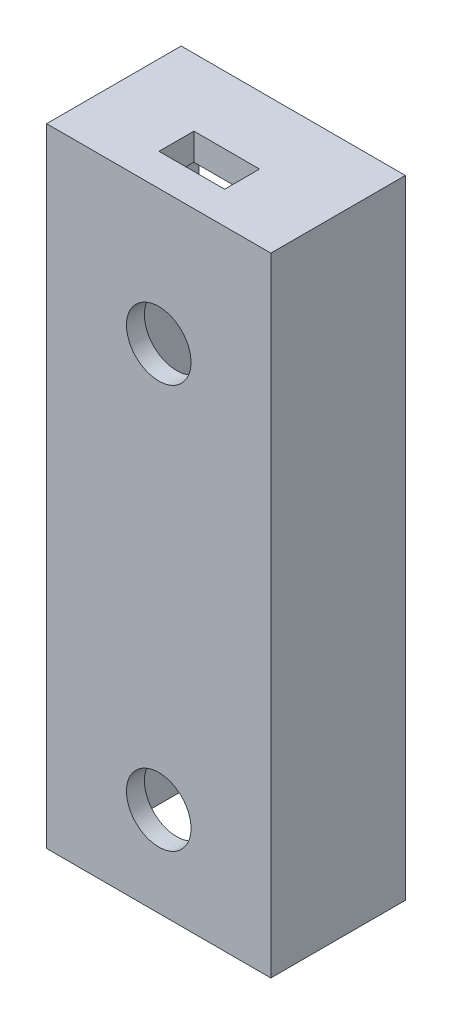
ISO-10303-21;
HEADER;
FILE_DESCRIPTION(('STEP AP214'),'2;1');
FILE_NAME('part.step','',(''),(''),'','','');
FILE_SCHEMA(('AUTOMOTIVE_DESIGN { 1 0 10303 214 1 1 1 1 }'));
ENDSEC;
DATA;
#1=APPLICATION_CONTEXT('core data for automotive mechanical design processes');
#2=APPLICATION_PROTOCOL_DEFINITION('international standard','automotive_design',2000,#1);
#3=PRODUCT_CONTEXT('',#1,'mechanical');
#4=PRODUCT('Part','Part','',(#3));
#5=PRODUCT_RELATED_PRODUCT_CATEGORY('part','',(#4));
#6=PRODUCT_DEFINITION_FORMATION('','',#4);
#7=PRODUCT_DEFINITION_CONTEXT('part definition',#1,'design');
#8=PRODUCT_DEFINITION('design','',#6,#7);
#9=PRODUCT_DEFINITION_SHAPE('','',#8);
#10=(LENGTH_UNIT() NAMED_UNIT(*) SI_UNIT(.MILLI.,.METRE.));
#11=(NAMED_UNIT(*) PLANE_ANGLE_UNIT() SI_UNIT($,.RADIAN.));
#12=(NAMED_UNIT(*) SI_UNIT($,.STERADIAN.) SOLID_ANGLE_UNIT());
#13=UNCERTAINTY_MEASURE_WITH_UNIT(LENGTH_MEASURE(1.E-05),#10,'distance_accuracy_value','');
#14=(GEOMETRIC_REPRESENTATION_CONTEXT(3) GLOBAL_UNCERTAINTY_ASSIGNED_CONTEXT((#13)) GLOBAL_UNIT_ASSIGNED_CONTEXT((#10,
#11,#12)) REPRESENTATION_CONTEXT('',''));
#15=CARTESIAN_POINT('',(0.,0.,0.));
#16=DIRECTION('',(0.,0.,1.));
#17=DIRECTION('',(1.,0.,0.));
#18=AXIS2_PLACEMENT_3D('',#15,#16,#17);
#19=CARTESIAN_POINT('',(-10.5,-35.001,-15.));
#20=DIRECTION('',(-1.,0.,0.));
#21=DIRECTION('',(0.,0.,1.));
#22=AXIS2_PLACEMENT_3D('',#19,#20,#21);
#23=PLANE('',#22);
#24=DIRECTION('',(0.,0.,-1.));
#25=VECTOR('',#24,1.);
#26=CARTESIAN_POINT('',(-10.5,32.,-15.));
#27=LINE('',#26,#25);
#28=CARTESIAN_POINT('',(-10.5,32.,-2.));
#29=VERTEX_POINT('',#28);
#30=CARTESIAN_POINT('',(-10.5,32.,-15.));
#31=VERTEX_POINT('',#30);
#32=EDGE_CURVE('E201',#29,#31,#27,.T.);
#33=ORIENTED_EDGE('',*,*,#32,.F.);
#34=DIRECTION('',(0.,1.,0.));
#35=VECTOR('',#34,1.);
#36=CARTESIAN_POINT('',(-10.5,-35.001,-2.));
#37=LINE('',#36,#35);
#38=CARTESIAN_POINT('',(-10.5,-35.,-2.));
#39=VERTEX_POINT('',#38);
#40=EDGE_CURVE('E212',#39,#29,#37,.T.);
#41=ORIENTED_EDGE('',*,*,#40,.F.);
#42=DIRECTION('',(0.,0.,1.));
#43=VECTOR('',#42,1.);
#44=CARTESIAN_POINT('',(-10.5,-35.,-15.));
#45=LINE('',#44,#43);
#46=CARTESIAN_POINT('',(-10.5,-35.,-15.));
#47=VERTEX_POINT('',#46);
#48=EDGE_CURVE('E206',#47,#39,#45,.T.);
#49=ORIENTED_EDGE('',*,*,#48,.F.);
#50=DIRECTION('',(0.,1.,0.));
#51=VECTOR('',#50,1.);
#52=CARTESIAN_POINT('',(-10.5,-35.001,-15.));
#53=LINE('',#52,#51);
#54=EDGE_CURVE('E76',#47,#31,#53,.T.);
#55=ORIENTED_EDGE('',*,*,#54,.T.);
#56=EDGE_LOOP('',(#33,#41,#49,#55));
#57=FACE_BOUND('',#56,.T.);
#58=ADVANCED_FACE('F64',(#57),#23,.F.);
#59=CARTESIAN_POINT('',(10.5,-35.001,-15.));
#60=DIRECTION('',(1.,0.,0.));
#61=DIRECTION('',(0.,0.,-1.));
#62=AXIS2_PLACEMENT_3D('',#59,#60,#61);
#63=PLANE('',#62);
#64=DIRECTION('',(0.,0.,1.));
#65=VECTOR('',#64,1.);
#66=CARTESIAN_POINT('',(10.5,32.,-15.));
#67=LINE('',#66,#65);
#68=CARTESIAN_POINT('',(10.5,32.,-15.));
#69=VERTEX_POINT('',#68);
#70=CARTESIAN_POINT('',(10.5,32.,-2.));
#71=VERTEX_POINT('',#70);
#72=EDGE_CURVE('E89',#69,#71,#67,.T.);
#73=ORIENTED_EDGE('',*,*,#72,.F.);
#74=DIRECTION('',(0.,1.,0.));
#75=VECTOR('',#74,1.);
#76=CARTESIAN_POINT('',(10.5,-35.001,-15.));
#77=LINE('',#76,#75);
#78=CARTESIAN_POINT('',(10.5,-35.,-15.));
#79=VERTEX_POINT('',#78);
#80=EDGE_CURVE('E211',#79,#69,#77,.T.);
#81=ORIENTED_EDGE('',*,*,#80,.F.);
#82=DIRECTION('',(0.,0.,-1.));
#83=VECTOR('',#82,1.);
#84=CARTESIAN_POINT('',(10.5,-35.,-15.));
#85=LINE('',#84,#83);
#86=CARTESIAN_POINT('',(10.5,-35.,-2.));
#87=VERTEX_POINT('',#86);
#88=EDGE_CURVE('E202',#87,#79,#85,.T.);
#89=ORIENTED_EDGE('',*,*,#88,.F.);
#90=DIRECTION('',(0.,1.,0.));
#91=VECTOR('',#90,1.);
#92=CARTESIAN_POINT('',(10.5,-35.001,-2.));
#93=LINE('',#92,#91);
#94=EDGE_CURVE('E219',#87,#71,#93,.T.);
#95=ORIENTED_EDGE('',*,*,#94,.T.);
#96=EDGE_LOOP('',(#73,#81,#89,#95));
#97=FACE_BOUND('',#96,.T.);
#98=ADVANCED_FACE('F280',(#97),#63,.F.);
#99=CARTESIAN_POINT('',(-10.5,-35.001,-2.));
#100=DIRECTION('',(0.,0.,1.));
#101=DIRECTION('',(1.,0.,0.));
#102=AXIS2_PLACEMENT_3D('',#99,#100,#101);
#103=PLANE('',#102);
#104=CARTESIAN_POINT('',(0.,20.,-2.));
#105=DIRECTION('',(0.,0.,-1.));
#106=DIRECTION('',(-1.,0.,0.));
#107=AXIS2_PLACEMENT_3D('',#104,#105,#106);
#108=CIRCLE('',#107,3.6);
#109=CARTESIAN_POINT('',(-3.59999999999999,20.,-2.));
#110=VERTEX_POINT('',#109);
#111=EDGE_CURVE('E312',#110,#110,#108,.T.);
#112=ORIENTED_EDGE('',*,*,#111,.F.);
#113=EDGE_LOOP('',(#112));
#114=FACE_BOUND('',#113,.T.);
#115=CARTESIAN_POINT('',(0.,-25.,-2.));
#116=DIRECTION('',(0.,0.,-1.));
#117=DIRECTION('',(-1.,0.,0.));
#118=AXIS2_PLACEMENT_3D('',#115,#116,#117);
#119=CIRCLE('',#118,3.6);
#120=CARTESIAN_POINT('',(-3.6,-25.,-2.));
#121=VERTEX_POINT('',#120);
#122=EDGE_CURVE('E182',#121,#121,#119,.T.);
#123=ORIENTED_EDGE('',*,*,#122,.F.);
#124=EDGE_LOOP('',(#123));
#125=FACE_BOUND('',#124,.T.);
#126=DIRECTION('',(-1.,0.,0.));
#127=VECTOR('',#126,1.);
#128=CARTESIAN_POINT('',(-10.5,32.,-2.));
#129=LINE('',#128,#127);
#130=EDGE_CURVE('E12',#71,#29,#129,.T.);
#131=ORIENTED_EDGE('',*,*,#130,.F.);
#132=ORIENTED_EDGE('',*,*,#94,.F.);
#133=DIRECTION('',(1.,0.,0.));
#134=VECTOR('',#133,1.);
#135=CARTESIAN_POINT('',(-10.5,-35.,-2.));
#136=LINE('',#135,#134);
#137=EDGE_CURVE('E214',#39,#87,#136,.T.);
#138=ORIENTED_EDGE('',*,*,#137,.F.);
#139=ORIENTED_EDGE('',*,*,#40,.T.);
#140=EDGE_LOOP('',(#131,#132,#138,#139));
#141=FACE_BOUND('',#140,.T.);
#142=ADVANCED_FACE('F274',(#114,#125,#141),#103,.F.);
#143=CARTESIAN_POINT('',(-12.5,-35.,-15.));
#144=DIRECTION('',(0.,-1.,0.));
#145=DIRECTION('',(1.,0.,0.));
#146=AXIS2_PLACEMENT_3D('',#143,#144,#145);
#147=PLANE('',#146);
#148=DIRECTION('',(1.,0.,0.));
#149=VECTOR('',#148,1.);
#150=CARTESIAN_POINT('',(-12.5,-35.,-15.));
#151=LINE('',#150,#149);
#152=CARTESIAN_POINT('',(-12.5,-35.,-15.));
#153=VERTEX_POINT('',#152);
#154=EDGE_CURVE('E227',#153,#47,#151,.T.);
#155=ORIENTED_EDGE('',*,*,#154,.T.);
#156=ORIENTED_EDGE('',*,*,#48,.T.);
#157=ORIENTED_EDGE('',*,*,#137,.T.);
#158=ORIENTED_EDGE('',*,*,#88,.T.);
#159=CARTESIAN_POINT('',(12.5,-35.,-15.));
#160=VERTEX_POINT('',#159);
#161=EDGE_CURVE('E222',#79,#160,#151,.T.);
#162=ORIENTED_EDGE('',*,*,#161,.T.);
#163=DIRECTION('',(0.,0.,1.));
#164=VECTOR('',#163,1.);
#165=CARTESIAN_POINT('',(12.5,-35.,-15.));
#166=LINE('',#165,#164);
#167=CARTESIAN_POINT('',(12.5,-35.,0.));
#168=VERTEX_POINT('',#167);
#169=EDGE_CURVE('E250',#160,#168,#166,.T.);
#170=ORIENTED_EDGE('',*,*,#169,.T.);
#171=DIRECTION('',(1.,0.,0.));
#172=VECTOR('',#171,1.);
#173=CARTESIAN_POINT('',(-12.5,-35.,0.));
#174=LINE('',#173,#172);
#175=CARTESIAN_POINT('',(-12.5,-35.,0.));
#176=VERTEX_POINT('',#175);
#177=EDGE_CURVE('E236',#176,#168,#174,.T.);
#178=ORIENTED_EDGE('',*,*,#177,.F.);
#179=DIRECTION('',(0.,0.,1.));
#180=VECTOR('',#179,1.);
#181=CARTESIAN_POINT('',(-12.5,-35.,-15.));
#182=LINE('',#181,#180);
#183=EDGE_CURVE('E234',#153,#176,#182,.T.);
#184=ORIENTED_EDGE('',*,*,#183,.F.);
#185=EDGE_LOOP('',(#155,#156,#157,#158,#162,#170,#178,#184));
#186=FACE_BOUND('',#185,.T.);
#187=ADVANCED_FACE('F260',(#186),#147,.T.);
#188=CARTESIAN_POINT('',(-12.5,-35.,-15.));
#189=DIRECTION('',(-1.,0.,0.));
#190=DIRECTION('',(0.,-1.,0.));
#191=AXIS2_PLACEMENT_3D('',#188,#189,#190);
#192=PLANE('',#191);
#193=DIRECTION('',(0.,-1.,0.));
#194=VECTOR('',#193,1.);
#195=CARTESIAN_POINT('',(-12.5,-35.,-15.));
#196=LINE('',#195,#194);
#197=CARTESIAN_POINT('',(-12.5,35.,-15.));
#198=VERTEX_POINT('',#197);
#199=EDGE_CURVE('E221',#198,#153,#196,.T.);
#200=ORIENTED_EDGE('',*,*,#199,.T.);
#201=ORIENTED_EDGE('',*,*,#183,.T.);
#202=DIRECTION('',(0.,-1.,0.));
#203=VECTOR('',#202,1.);
#204=CARTESIAN_POINT('',(-12.5,-35.,0.));
#205=LINE('',#204,#203);
#206=CARTESIAN_POINT('',(-12.5,35.,0.));
#207=VERTEX_POINT('',#206);
#208=EDGE_CURVE('E225',#207,#176,#205,.T.);
#209=ORIENTED_EDGE('',*,*,#208,.F.);
#210=DIRECTION('',(0.,0.,1.));
#211=VECTOR('',#210,1.);
#212=CARTESIAN_POINT('',(-12.5,35.,-15.));
#213=LINE('',#212,#211);
#214=EDGE_CURVE('E73',#198,#207,#213,.T.);
#215=ORIENTED_EDGE('',*,*,#214,.F.);
#216=EDGE_LOOP('',(#200,#201,#209,#215));
#217=FACE_BOUND('',#216,.T.);
#218=ADVANCED_FACE('F63',(#217),#192,.T.);
#219=CARTESIAN_POINT('',(-12.5,35.,-15.));
#220=DIRECTION('',(0.,1.,0.));
#221=DIRECTION('',(0.,0.,1.));
#222=AXIS2_PLACEMENT_3D('',#219,#220,#221);
#223=PLANE('',#222);
#224=DIRECTION('',(-1.,0.,0.));
#225=VECTOR('',#224,1.);
#226=CARTESIAN_POINT('',(-12.5,35.,-15.));
#227=LINE('',#226,#225);
#228=CARTESIAN_POINT('',(12.5,35.,-15.));
#229=VERTEX_POINT('',#228);
#230=EDGE_CURVE('E235',#229,#198,#227,.T.);
#231=ORIENTED_EDGE('',*,*,#230,.T.);
#232=ORIENTED_EDGE('',*,*,#214,.T.);
#233=DIRECTION('',(-1.,0.,0.));
#234=VECTOR('',#233,1.);
#235=CARTESIAN_POINT('',(-12.5,35.,0.));
#236=LINE('',#235,#234);
#237=CARTESIAN_POINT('',(12.5,35.,0.));
#238=VERTEX_POINT('',#237);
#239=EDGE_CURVE('E228',#238,#207,#236,.T.);
#240=ORIENTED_EDGE('',*,*,#239,.F.);
#241=DIRECTION('',(0.,0.,1.));
#242=VECTOR('',#241,1.);
#243=CARTESIAN_POINT('',(12.5,35.,-15.));
#244=LINE('',#243,#242);
#245=EDGE_CURVE('E242',#229,#238,#244,.T.);
#246=ORIENTED_EDGE('',*,*,#245,.F.);
#247=EDGE_LOOP('',(#231,#232,#240,#246));
#248=FACE_BOUND('',#247,.T.);
#249=DIRECTION('',(1.,0.,0.));
#250=VECTOR('',#249,1.);
#251=CARTESIAN_POINT('',(0.,35.,-3.59451654764864));
#252=LINE('',#251,#250);
#253=CARTESIAN_POINT('',(-3.56776568673868,35.,-3.59451654764864));
#254=VERTEX_POINT('',#253);
#255=CARTESIAN_POINT('',(3.75310416397187,35.,-3.59451654764864));
#256=VERTEX_POINT('',#255);
#257=EDGE_CURVE('E157',#254,#256,#252,.T.);
#258=ORIENTED_EDGE('',*,*,#257,.F.);
#259=DIRECTION('',(0.,0.,-1.));
#260=VECTOR('',#259,1.);
#261=CARTESIAN_POINT('',(-3.56776568673868,35.,0.));
#262=LINE('',#261,#260);
#263=CARTESIAN_POINT('',(-3.56776568673868,35.,-7.48662456954539));
#264=VERTEX_POINT('',#263);
#265=EDGE_CURVE('E180',#254,#264,#262,.T.);
#266=ORIENTED_EDGE('',*,*,#265,.T.);
#267=DIRECTION('',(1.,0.,0.));
#268=VECTOR('',#267,1.);
#269=CARTESIAN_POINT('',(0.,35.,-7.48662456954539));
#270=LINE('',#269,#268);
#271=CARTESIAN_POINT('',(3.75310416397187,35.,-7.48662456954539));
#272=VERTEX_POINT('',#271);
#273=EDGE_CURVE('E179',#264,#272,#270,.T.);
#274=ORIENTED_EDGE('',*,*,#273,.T.);
#275=DIRECTION('',(0.,0.,-1.));
#276=VECTOR('',#275,1.);
#277=CARTESIAN_POINT('',(3.75310416397187,35.,0.));
#278=LINE('',#277,#276);
#279=EDGE_CURVE('E186',#256,#272,#278,.T.);
#280=ORIENTED_EDGE('',*,*,#279,.F.);
#281=EDGE_LOOP('',(#258,#266,#274,#280));
#282=FACE_BOUND('',#281,.T.);
#283=ADVANCED_FACE('F262',(#248,#282),#223,.T.);
#284=CARTESIAN_POINT('',(12.5,-35.,-15.));
#285=DIRECTION('',(1.,0.,0.));
#286=DIRECTION('',(0.,1.,0.));
#287=AXIS2_PLACEMENT_3D('',#284,#285,#286);
#288=PLANE('',#287);
#289=DIRECTION('',(0.,1.,0.));
#290=VECTOR('',#289,1.);
#291=CARTESIAN_POINT('',(12.5,-35.,-15.));
#292=LINE('',#291,#290);
#293=EDGE_CURVE('E229',#160,#229,#292,.T.);
#294=ORIENTED_EDGE('',*,*,#293,.T.);
#295=ORIENTED_EDGE('',*,*,#245,.T.);
#296=DIRECTION('',(0.,1.,0.));
#297=VECTOR('',#296,1.);
#298=CARTESIAN_POINT('',(12.5,-35.,0.));
#299=LINE('',#298,#297);
#300=EDGE_CURVE('E237',#168,#238,#299,.T.);
#301=ORIENTED_EDGE('',*,*,#300,.F.);
#302=ORIENTED_EDGE('',*,*,#169,.F.);
#303=EDGE_LOOP('',(#294,#295,#301,#302));
#304=FACE_BOUND('',#303,.T.);
#305=ADVANCED_FACE('F276',(#304),#288,.T.);
#306=CARTESIAN_POINT('',(0.,0.,-15.));
#307=DIRECTION('',(0.,0.,-1.));
#308=DIRECTION('',(-1.,0.,0.));
#309=AXIS2_PLACEMENT_3D('',#306,#307,#308);
#310=PLANE('',#309);
#311=ORIENTED_EDGE('',*,*,#199,.F.);
#312=ORIENTED_EDGE('',*,*,#230,.F.);
#313=ORIENTED_EDGE('',*,*,#293,.F.);
#314=ORIENTED_EDGE('',*,*,#161,.F.);
#315=ORIENTED_EDGE('',*,*,#80,.T.);
#316=DIRECTION('',(1.,0.,0.));
#317=VECTOR('',#316,1.);
#318=CARTESIAN_POINT('',(-12.5,32.,-15.));
#319=LINE('',#318,#317);
#320=EDGE_CURVE('E199',#31,#69,#319,.T.);
#321=ORIENTED_EDGE('',*,*,#320,.F.);
#322=ORIENTED_EDGE('',*,*,#54,.F.);
#323=ORIENTED_EDGE('',*,*,#154,.F.);
#324=EDGE_LOOP('',(#311,#312,#313,#314,#315,#321,#322,#323));
#325=FACE_BOUND('',#324,.T.);
#326=ADVANCED_FACE('F269',(#325),#310,.T.);
#327=CARTESIAN_POINT('',(0.,0.,0.));
#328=DIRECTION('',(0.,0.,-1.));
#329=DIRECTION('',(-1.,0.,0.));
#330=AXIS2_PLACEMENT_3D('',#327,#328,#329);
#331=PLANE('',#330);
#332=CARTESIAN_POINT('',(0.,20.,0.));
#333=DIRECTION('',(0.,0.,-1.));
#334=DIRECTION('',(-1.,0.,0.));
#335=AXIS2_PLACEMENT_3D('',#332,#333,#334);
#336=CIRCLE('',#335,3.6);
#337=CARTESIAN_POINT('',(-3.59999999999999,20.,0.));
#338=VERTEX_POINT('',#337);
#339=EDGE_CURVE('E188',#338,#338,#336,.F.);
#340=ORIENTED_EDGE('',*,*,#339,.F.);
#341=EDGE_LOOP('',(#340));
#342=FACE_BOUND('',#341,.T.);
#343=CARTESIAN_POINT('',(0.,-25.,0.));
#344=DIRECTION('',(0.,0.,-1.));
#345=DIRECTION('',(-1.,0.,0.));
#346=AXIS2_PLACEMENT_3D('',#343,#344,#345);
#347=CIRCLE('',#346,3.6);
#348=CARTESIAN_POINT('',(-3.6,-25.,0.));
#349=VERTEX_POINT('',#348);
#350=EDGE_CURVE('E309',#349,#349,#347,.F.);
#351=ORIENTED_EDGE('',*,*,#350,.F.);
#352=EDGE_LOOP('',(#351));
#353=FACE_BOUND('',#352,.T.);
#354=ORIENTED_EDGE('',*,*,#208,.T.);
#355=ORIENTED_EDGE('',*,*,#177,.T.);
#356=ORIENTED_EDGE('',*,*,#300,.T.);
#357=ORIENTED_EDGE('',*,*,#239,.T.);
#358=EDGE_LOOP('',(#354,#355,#356,#357));
#359=FACE_BOUND('',#358,.T.);
#360=ADVANCED_FACE('F264',(#342,#353,#359),#331,.F.);
#361=CARTESIAN_POINT('',(0.,32.,0.));
#362=DIRECTION('',(0.,1.,0.));
#363=DIRECTION('',(0.,0.,1.));
#364=AXIS2_PLACEMENT_3D('',#361,#362,#363);
#365=PLANE('',#364);
#366=DIRECTION('',(0.,0.,-1.));
#367=VECTOR('',#366,1.);
#368=CARTESIAN_POINT('',(-3.56776568673868,32.,0.));
#369=LINE('',#368,#367);
#370=CARTESIAN_POINT('',(-3.56776568673868,32.,-3.59451654764864));
#371=VERTEX_POINT('',#370);
#372=CARTESIAN_POINT('',(-3.56776568673868,32.,-7.48662456954539));
#373=VERTEX_POINT('',#372);
#374=EDGE_CURVE('E164',#371,#373,#369,.T.);
#375=ORIENTED_EDGE('',*,*,#374,.F.);
#376=DIRECTION('',(1.,0.,0.));
#377=VECTOR('',#376,1.);
#378=CARTESIAN_POINT('',(0.,32.,-3.59451654764864));
#379=LINE('',#378,#377);
#380=CARTESIAN_POINT('',(3.75310416397187,32.,-3.59451654764864));
#381=VERTEX_POINT('',#380);
#382=EDGE_CURVE('E160',#371,#381,#379,.T.);
#383=ORIENTED_EDGE('',*,*,#382,.T.);
#384=DIRECTION('',(0.,0.,-1.));
#385=VECTOR('',#384,1.);
#386=CARTESIAN_POINT('',(3.75310416397187,32.,0.));
#387=LINE('',#386,#385);
#388=CARTESIAN_POINT('',(3.75310416397187,32.,-7.48662456954539));
#389=VERTEX_POINT('',#388);
#390=EDGE_CURVE('E166',#381,#389,#387,.T.);
#391=ORIENTED_EDGE('',*,*,#390,.T.);
#392=DIRECTION('',(1.,0.,0.));
#393=VECTOR('',#392,1.);
#394=CARTESIAN_POINT('',(0.,32.,-7.48662456954539));
#395=LINE('',#394,#393);
#396=EDGE_CURVE('E173',#373,#389,#395,.T.);
#397=ORIENTED_EDGE('',*,*,#396,.F.);
#398=EDGE_LOOP('',(#375,#383,#391,#397));
#399=FACE_BOUND('',#398,.T.);
#400=ORIENTED_EDGE('',*,*,#130,.T.);
#401=ORIENTED_EDGE('',*,*,#32,.T.);
#402=ORIENTED_EDGE('',*,*,#320,.T.);
#403=ORIENTED_EDGE('',*,*,#72,.T.);
#404=EDGE_LOOP('',(#400,#401,#402,#403));
#405=FACE_BOUND('',#404,.T.);
#406=ADVANCED_FACE('F174',(#399,#405),#365,.F.);
#407=CARTESIAN_POINT('',(0.,32.,-3.59451654764864));
#408=DIRECTION('',(0.,0.,1.));
#409=DIRECTION('',(1.,0.,0.));
#410=AXIS2_PLACEMENT_3D('',#407,#408,#409);
#411=PLANE('',#410);
#412=ORIENTED_EDGE('',*,*,#257,.T.);
#413=DIRECTION('',(0.,1.,0.));
#414=VECTOR('',#413,1.);
#415=CARTESIAN_POINT('',(3.75310416397187,32.,-3.59451654764864));
#416=LINE('',#415,#414);
#417=EDGE_CURVE('E155',#381,#256,#416,.T.);
#418=ORIENTED_EDGE('',*,*,#417,.F.);
#419=ORIENTED_EDGE('',*,*,#382,.F.);
#420=DIRECTION('',(0.,1.,0.));
#421=VECTOR('',#420,1.);
#422=CARTESIAN_POINT('',(-3.56776568673868,32.,-3.59451654764864));
#423=LINE('',#422,#421);
#424=EDGE_CURVE('E191',#371,#254,#423,.T.);
#425=ORIENTED_EDGE('',*,*,#424,.T.);
#426=EDGE_LOOP('',(#412,#418,#419,#425));
#427=FACE_BOUND('',#426,.T.);
#428=ADVANCED_FACE('F152',(#427),#411,.F.);
#429=CARTESIAN_POINT('',(-3.56776568673868,32.,0.));
#430=DIRECTION('',(1.,0.,0.));
#431=DIRECTION('',(0.,0.,-1.));
#432=AXIS2_PLACEMENT_3D('',#429,#430,#431);
#433=PLANE('',#432);
#434=ORIENTED_EDGE('',*,*,#265,.F.);
#435=ORIENTED_EDGE('',*,*,#424,.F.);
#436=ORIENTED_EDGE('',*,*,#374,.T.);
#437=DIRECTION('',(0.,1.,0.));
#438=VECTOR('',#437,1.);
#439=CARTESIAN_POINT('',(-3.56776568673868,32.,-7.48662456954539));
#440=LINE('',#439,#438);
#441=EDGE_CURVE('E196',#373,#264,#440,.T.);
#442=ORIENTED_EDGE('',*,*,#441,.T.);
#443=EDGE_LOOP('',(#434,#435,#436,#442));
#444=FACE_BOUND('',#443,.T.);
#445=ADVANCED_FACE('F332',(#444),#433,.T.);
#446=CARTESIAN_POINT('',(0.,32.,-7.48662456954539));
#447=DIRECTION('',(0.,0.,1.));
#448=DIRECTION('',(1.,0.,0.));
#449=AXIS2_PLACEMENT_3D('',#446,#447,#448);
#450=PLANE('',#449);
#451=ORIENTED_EDGE('',*,*,#273,.F.);
#452=ORIENTED_EDGE('',*,*,#441,.F.);
#453=ORIENTED_EDGE('',*,*,#396,.T.);
#454=DIRECTION('',(0.,1.,0.));
#455=VECTOR('',#454,1.);
#456=CARTESIAN_POINT('',(3.75310416397187,32.,-7.48662456954539));
#457=LINE('',#456,#455);
#458=EDGE_CURVE('E165',#389,#272,#457,.T.);
#459=ORIENTED_EDGE('',*,*,#458,.T.);
#460=EDGE_LOOP('',(#451,#452,#453,#459));
#461=FACE_BOUND('',#460,.T.);
#462=ADVANCED_FACE('F335',(#461),#450,.T.);
#463=CARTESIAN_POINT('',(3.75310416397187,32.,0.));
#464=DIRECTION('',(1.,0.,0.));
#465=DIRECTION('',(0.,0.,-1.));
#466=AXIS2_PLACEMENT_3D('',#463,#464,#465);
#467=PLANE('',#466);
#468=ORIENTED_EDGE('',*,*,#279,.T.);
#469=ORIENTED_EDGE('',*,*,#458,.F.);
#470=ORIENTED_EDGE('',*,*,#390,.F.);
#471=ORIENTED_EDGE('',*,*,#417,.T.);
#472=EDGE_LOOP('',(#468,#469,#470,#471));
#473=FACE_BOUND('',#472,.T.);
#474=ADVANCED_FACE('F169',(#473),#467,.F.);
#475=CARTESIAN_POINT('',(0.,-25.,0.00100000000000013));
#476=DIRECTION('',(0.,0.,-1.));
#477=DIRECTION('',(-1.,0.,0.));
#478=AXIS2_PLACEMENT_3D('',#475,#476,#477);
#479=CYLINDRICAL_SURFACE('',#478,3.6);
#480=ORIENTED_EDGE('',*,*,#122,.T.);
#481=EDGE_LOOP('',(#480));
#482=FACE_BOUND('',#481,.T.);
#483=ORIENTED_EDGE('',*,*,#350,.T.);
#484=EDGE_LOOP('',(#483));
#485=FACE_BOUND('',#484,.T.);
#486=ADVANCED_FACE('F323',(#482,#485),#479,.F.);
#487=CARTESIAN_POINT('',(0.,20.,0.00100000000000013));
#488=DIRECTION('',(0.,0.,-1.));
#489=DIRECTION('',(-1.,0.,0.));
#490=AXIS2_PLACEMENT_3D('',#487,#488,#489);
#491=CYLINDRICAL_SURFACE('',#490,3.6);
#492=ORIENTED_EDGE('',*,*,#111,.T.);
#493=EDGE_LOOP('',(#492));
#494=FACE_BOUND('',#493,.T.);
#495=ORIENTED_EDGE('',*,*,#339,.T.);
#496=EDGE_LOOP('',(#495));
#497=FACE_BOUND('',#496,.T.);
#498=ADVANCED_FACE('F316',(#494,#497),#491,.F.);
#499=CLOSED_SHELL('',(#58,#98,#142,#187,#218,#283,#305,#326,#360,#406,#428,#445,#462,#474,#486,#498));
#500=MANIFOLD_SOLID_BREP('B2',#499);
#501=ADVANCED_BREP_SHAPE_REPRESENTATION('',(#18,#500),#14);
#502=SHAPE_DEFINITION_REPRESENTATION(#9,#501);
ENDSEC;
END-ISO-10303-21;
